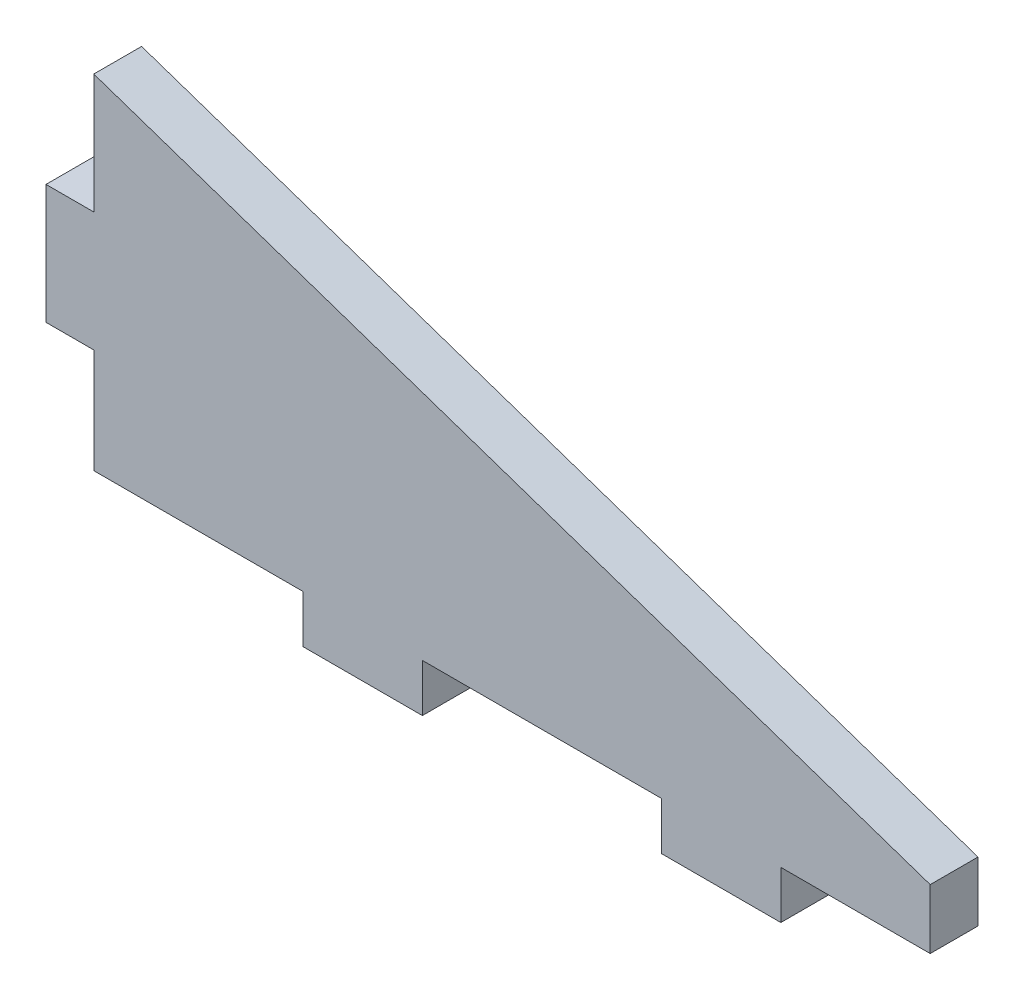
ISO-10303-21;
HEADER;
FILE_DESCRIPTION(('STEP AP214'),'2;1');
FILE_NAME('part.step','',(''),(''),'','','');
FILE_SCHEMA(('AUTOMOTIVE_DESIGN { 1 0 10303 214 1 1 1 1 }'));
ENDSEC;
DATA;
#1=APPLICATION_CONTEXT('core data for automotive mechanical design processes');
#2=APPLICATION_PROTOCOL_DEFINITION('international standard','automotive_design',2000,#1);
#3=PRODUCT_CONTEXT('',#1,'mechanical');
#4=PRODUCT('Part','Part','',(#3));
#5=PRODUCT_RELATED_PRODUCT_CATEGORY('part','',(#4));
#6=PRODUCT_DEFINITION_FORMATION('','',#4);
#7=PRODUCT_DEFINITION_CONTEXT('part definition',#1,'design');
#8=PRODUCT_DEFINITION('design','',#6,#7);
#9=PRODUCT_DEFINITION_SHAPE('','',#8);
#10=(LENGTH_UNIT() NAMED_UNIT(*) SI_UNIT(.MILLI.,.METRE.));
#11=(NAMED_UNIT(*) PLANE_ANGLE_UNIT() SI_UNIT($,.RADIAN.));
#12=(NAMED_UNIT(*) SI_UNIT($,.STERADIAN.) SOLID_ANGLE_UNIT());
#13=UNCERTAINTY_MEASURE_WITH_UNIT(LENGTH_MEASURE(1.E-05),#10,'distance_accuracy_value','');
#14=(GEOMETRIC_REPRESENTATION_CONTEXT(3) GLOBAL_UNCERTAINTY_ASSIGNED_CONTEXT((#13)) GLOBAL_UNIT_ASSIGNED_CONTEXT((#10,
#11,#12)) REPRESENTATION_CONTEXT('',''));
#15=CARTESIAN_POINT('',(0.,0.,0.));
#16=DIRECTION('',(0.,0.,1.));
#17=DIRECTION('',(1.,0.,0.));
#18=AXIS2_PLACEMENT_3D('',#15,#16,#17);
#19=CARTESIAN_POINT('',(-219.5,0.,-4.));
#20=DIRECTION('',(0.,-1.,0.));
#21=DIRECTION('',(-1.,0.,0.));
#22=AXIS2_PLACEMENT_3D('',#19,#20,#21);
#23=PLANE('',#22);
#24=DIRECTION('',(-1.,0.,0.));
#25=VECTOR('',#24,1.);
#26=CARTESIAN_POINT('',(-219.5,0.,4.));
#27=LINE('',#26,#25);
#28=CARTESIAN_POINT('',(-194.5,0.,4.));
#29=VERTEX_POINT('',#28);
#30=CARTESIAN_POINT('',(-219.5,0.,4.));
#31=VERTEX_POINT('',#30);
#32=EDGE_CURVE('E183',#29,#31,#27,.T.);
#33=ORIENTED_EDGE('',*,*,#32,.T.);
#34=DIRECTION('',(0.,0.,1.));
#35=VECTOR('',#34,1.);
#36=CARTESIAN_POINT('',(-219.5,0.,-4.));
#37=LINE('',#36,#35);
#38=CARTESIAN_POINT('',(-219.5,0.,-4.));
#39=VERTEX_POINT('',#38);
#40=EDGE_CURVE('E42',#39,#31,#37,.T.);
#41=ORIENTED_EDGE('',*,*,#40,.F.);
#42=DIRECTION('',(-1.,0.,0.));
#43=VECTOR('',#42,1.);
#44=CARTESIAN_POINT('',(-219.5,0.,-4.));
#45=LINE('',#44,#43);
#46=CARTESIAN_POINT('',(-194.5,0.,-4.));
#47=VERTEX_POINT('',#46);
#48=EDGE_CURVE('E212',#47,#39,#45,.T.);
#49=ORIENTED_EDGE('',*,*,#48,.F.);
#50=DIRECTION('',(0.,0.,1.));
#51=VECTOR('',#50,1.);
#52=CARTESIAN_POINT('',(-194.5,0.,-4.));
#53=LINE('',#52,#51);
#54=EDGE_CURVE('E11',#47,#29,#53,.T.);
#55=ORIENTED_EDGE('',*,*,#54,.T.);
#56=EDGE_LOOP('',(#33,#41,#49,#55));
#57=FACE_BOUND('',#56,.T.);
#58=ADVANCED_FACE('F39',(#57),#23,.T.);
#59=CARTESIAN_POINT('',(-194.5,0.,-4.));
#60=DIRECTION('',(1.,0.,0.));
#61=DIRECTION('',(0.,0.,1.));
#62=AXIS2_PLACEMENT_3D('',#59,#60,#61);
#63=PLANE('',#62);
#64=DIRECTION('',(0.,-1.,0.));
#65=VECTOR('',#64,1.);
#66=CARTESIAN_POINT('',(-194.5,0.,4.));
#67=LINE('',#66,#65);
#68=CARTESIAN_POINT('',(-194.5,9.99999999999999,4.));
#69=VERTEX_POINT('',#68);
#70=EDGE_CURVE('E116',#69,#29,#67,.T.);
#71=ORIENTED_EDGE('',*,*,#70,.T.);
#72=ORIENTED_EDGE('',*,*,#54,.F.);
#73=DIRECTION('',(0.,-1.,0.));
#74=VECTOR('',#73,1.);
#75=CARTESIAN_POINT('',(-194.5,0.,-4.));
#76=LINE('',#75,#74);
#77=CARTESIAN_POINT('',(-194.5,9.99999999999999,-4.));
#78=VERTEX_POINT('',#77);
#79=EDGE_CURVE('E57',#78,#47,#76,.T.);
#80=ORIENTED_EDGE('',*,*,#79,.F.);
#81=DIRECTION('',(0.,0.,1.));
#82=VECTOR('',#81,1.);
#83=CARTESIAN_POINT('',(-194.5,9.99999999999999,-4.));
#84=LINE('',#83,#82);
#85=EDGE_CURVE('E48',#78,#69,#84,.T.);
#86=ORIENTED_EDGE('',*,*,#85,.T.);
#87=EDGE_LOOP('',(#71,#72,#80,#86));
#88=FACE_BOUND('',#87,.T.);
#89=ADVANCED_FACE('F337',(#88),#63,.T.);
#90=CARTESIAN_POINT('',(-194.5,9.99999999999999,-4.));
#91=DIRECTION('',(0.32129634474976,0.946978700315083,0.));
#92=DIRECTION('',(0.946978700315083,-0.32129634474976,0.));
#93=AXIS2_PLACEMENT_3D('',#90,#91,#92);
#94=PLANE('',#93);
#95=DIRECTION('',(0.946978700315083,-0.32129634474976,0.));
#96=VECTOR('',#95,1.);
#97=CARTESIAN_POINT('',(-194.5,9.99999999999999,4.));
#98=LINE('',#97,#96);
#99=CARTESIAN_POINT('',(-334.5,57.5,4.));
#100=VERTEX_POINT('',#99);
#101=EDGE_CURVE('E110',#100,#69,#98,.T.);
#102=ORIENTED_EDGE('',*,*,#101,.T.);
#103=ORIENTED_EDGE('',*,*,#85,.F.);
#104=DIRECTION('',(0.946978700315083,-0.32129634474976,0.));
#105=VECTOR('',#104,1.);
#106=CARTESIAN_POINT('',(-194.5,9.99999999999999,-4.));
#107=LINE('',#106,#105);
#108=CARTESIAN_POINT('',(-334.5,57.5,-4.));
#109=VERTEX_POINT('',#108);
#110=EDGE_CURVE('E165',#109,#78,#107,.T.);
#111=ORIENTED_EDGE('',*,*,#110,.F.);
#112=DIRECTION('',(0.,0.,1.));
#113=VECTOR('',#112,1.);
#114=CARTESIAN_POINT('',(-334.5,57.5,-4.));
#115=LINE('',#114,#113);
#116=EDGE_CURVE('E172',#109,#100,#115,.T.);
#117=ORIENTED_EDGE('',*,*,#116,.T.);
#118=EDGE_LOOP('',(#102,#103,#111,#117));
#119=FACE_BOUND('',#118,.T.);
#120=ADVANCED_FACE('F178',(#119),#94,.T.);
#121=CARTESIAN_POINT('',(-334.5,57.5,-4.));
#122=DIRECTION('',(-1.,0.,0.));
#123=DIRECTION('',(0.,0.,-1.));
#124=AXIS2_PLACEMENT_3D('',#121,#122,#123);
#125=PLANE('',#124);
#126=DIRECTION('',(0.,1.,0.));
#127=VECTOR('',#126,1.);
#128=CARTESIAN_POINT('',(-334.5,57.5,4.));
#129=LINE('',#128,#127);
#130=CARTESIAN_POINT('',(-334.5,37.5,4.));
#131=VERTEX_POINT('',#130);
#132=EDGE_CURVE('E175',#131,#100,#129,.T.);
#133=ORIENTED_EDGE('',*,*,#132,.T.);
#134=ORIENTED_EDGE('',*,*,#116,.F.);
#135=DIRECTION('',(0.,1.,0.));
#136=VECTOR('',#135,1.);
#137=CARTESIAN_POINT('',(-334.5,57.5,-4.));
#138=LINE('',#137,#136);
#139=CARTESIAN_POINT('',(-334.5,37.5,-4.));
#140=VERTEX_POINT('',#139);
#141=EDGE_CURVE('E161',#140,#109,#138,.T.);
#142=ORIENTED_EDGE('',*,*,#141,.F.);
#143=DIRECTION('',(0.,0.,1.));
#144=VECTOR('',#143,1.);
#145=CARTESIAN_POINT('',(-334.5,37.5,-4.));
#146=LINE('',#145,#144);
#147=EDGE_CURVE('E176',#140,#131,#146,.T.);
#148=ORIENTED_EDGE('',*,*,#147,.T.);
#149=EDGE_LOOP('',(#133,#134,#142,#148));
#150=FACE_BOUND('',#149,.T.);
#151=ADVANCED_FACE('F173',(#150),#125,.T.);
#152=CARTESIAN_POINT('',(-334.5,37.5,-4.));
#153=DIRECTION('',(0.,1.,0.));
#154=DIRECTION('',(0.,0.,1.));
#155=AXIS2_PLACEMENT_3D('',#152,#153,#154);
#156=PLANE('',#155);
#157=DIRECTION('',(1.,0.,0.));
#158=VECTOR('',#157,1.);
#159=CARTESIAN_POINT('',(-334.5,37.5,4.));
#160=LINE('',#159,#158);
#161=CARTESIAN_POINT('',(-342.5,37.5,4.));
#162=VERTEX_POINT('',#161);
#163=EDGE_CURVE('E208',#162,#131,#160,.T.);
#164=ORIENTED_EDGE('',*,*,#163,.T.);
#165=ORIENTED_EDGE('',*,*,#147,.F.);
#166=DIRECTION('',(1.,0.,0.));
#167=VECTOR('',#166,1.);
#168=CARTESIAN_POINT('',(-334.5,37.5,-4.));
#169=LINE('',#168,#167);
#170=CARTESIAN_POINT('',(-342.5,37.5,-4.));
#171=VERTEX_POINT('',#170);
#172=EDGE_CURVE('E167',#171,#140,#169,.T.);
#173=ORIENTED_EDGE('',*,*,#172,.F.);
#174=DIRECTION('',(0.,0.,1.));
#175=VECTOR('',#174,1.);
#176=CARTESIAN_POINT('',(-342.5,37.5,-4.));
#177=LINE('',#176,#175);
#178=EDGE_CURVE('E216',#171,#162,#177,.T.);
#179=ORIENTED_EDGE('',*,*,#178,.T.);
#180=EDGE_LOOP('',(#164,#165,#173,#179));
#181=FACE_BOUND('',#180,.T.);
#182=ADVANCED_FACE('F296',(#181),#156,.T.);
#183=CARTESIAN_POINT('',(-342.5,37.5,-4.));
#184=DIRECTION('',(-1.,0.,0.));
#185=DIRECTION('',(0.,0.,-1.));
#186=AXIS2_PLACEMENT_3D('',#183,#184,#185);
#187=PLANE('',#186);
#188=DIRECTION('',(0.,1.,0.));
#189=VECTOR('',#188,1.);
#190=CARTESIAN_POINT('',(-342.5,37.5,4.));
#191=LINE('',#190,#189);
#192=CARTESIAN_POINT('',(-342.5,17.5,4.));
#193=VERTEX_POINT('',#192);
#194=EDGE_CURVE('E206',#193,#162,#191,.T.);
#195=ORIENTED_EDGE('',*,*,#194,.T.);
#196=ORIENTED_EDGE('',*,*,#178,.F.);
#197=DIRECTION('',(0.,1.,0.));
#198=VECTOR('',#197,1.);
#199=CARTESIAN_POINT('',(-342.5,37.5,-4.));
#200=LINE('',#199,#198);
#201=CARTESIAN_POINT('',(-342.5,17.5,-4.));
#202=VERTEX_POINT('',#201);
#203=EDGE_CURVE('E286',#202,#171,#200,.T.);
#204=ORIENTED_EDGE('',*,*,#203,.F.);
#205=DIRECTION('',(0.,0.,1.));
#206=VECTOR('',#205,1.);
#207=CARTESIAN_POINT('',(-342.5,17.5,-4.));
#208=LINE('',#207,#206);
#209=EDGE_CURVE('E219',#202,#193,#208,.T.);
#210=ORIENTED_EDGE('',*,*,#209,.T.);
#211=EDGE_LOOP('',(#195,#196,#204,#210));
#212=FACE_BOUND('',#211,.T.);
#213=ADVANCED_FACE('F292',(#212),#187,.T.);
#214=CARTESIAN_POINT('',(-342.5,17.5,-4.));
#215=DIRECTION('',(0.,-1.,0.));
#216=DIRECTION('',(0.,0.,-1.));
#217=AXIS2_PLACEMENT_3D('',#214,#215,#216);
#218=PLANE('',#217);
#219=DIRECTION('',(-1.,0.,0.));
#220=VECTOR('',#219,1.);
#221=CARTESIAN_POINT('',(-342.5,17.5,4.));
#222=LINE('',#221,#220);
#223=CARTESIAN_POINT('',(-334.5,17.5,4.));
#224=VERTEX_POINT('',#223);
#225=EDGE_CURVE('E204',#224,#193,#222,.T.);
#226=ORIENTED_EDGE('',*,*,#225,.T.);
#227=ORIENTED_EDGE('',*,*,#209,.F.);
#228=DIRECTION('',(-1.,0.,0.));
#229=VECTOR('',#228,1.);
#230=CARTESIAN_POINT('',(-342.5,17.5,-4.));
#231=LINE('',#230,#229);
#232=CARTESIAN_POINT('',(-334.5,17.5,-4.));
#233=VERTEX_POINT('',#232);
#234=EDGE_CURVE('E284',#233,#202,#231,.T.);
#235=ORIENTED_EDGE('',*,*,#234,.F.);
#236=DIRECTION('',(0.,0.,1.));
#237=VECTOR('',#236,1.);
#238=CARTESIAN_POINT('',(-334.5,17.5,-4.));
#239=LINE('',#238,#237);
#240=EDGE_CURVE('E222',#233,#224,#239,.T.);
#241=ORIENTED_EDGE('',*,*,#240,.T.);
#242=EDGE_LOOP('',(#226,#227,#235,#241));
#243=FACE_BOUND('',#242,.T.);
#244=ADVANCED_FACE('F301',(#243),#218,.T.);
#245=CARTESIAN_POINT('',(-334.5,17.5,-4.));
#246=DIRECTION('',(-1.,0.,0.));
#247=DIRECTION('',(0.,0.,-1.));
#248=AXIS2_PLACEMENT_3D('',#245,#246,#247);
#249=PLANE('',#248);
#250=DIRECTION('',(0.,1.,0.));
#251=VECTOR('',#250,1.);
#252=CARTESIAN_POINT('',(-334.5,17.5,4.));
#253=LINE('',#252,#251);
#254=CARTESIAN_POINT('',(-334.5,0.,4.));
#255=VERTEX_POINT('',#254);
#256=EDGE_CURVE('E202',#255,#224,#253,.T.);
#257=ORIENTED_EDGE('',*,*,#256,.T.);
#258=ORIENTED_EDGE('',*,*,#240,.F.);
#259=DIRECTION('',(0.,1.,0.));
#260=VECTOR('',#259,1.);
#261=CARTESIAN_POINT('',(-334.5,17.5,-4.));
#262=LINE('',#261,#260);
#263=CARTESIAN_POINT('',(-334.5,0.,-4.));
#264=VERTEX_POINT('',#263);
#265=EDGE_CURVE('E282',#264,#233,#262,.T.);
#266=ORIENTED_EDGE('',*,*,#265,.F.);
#267=DIRECTION('',(0.,0.,1.));
#268=VECTOR('',#267,1.);
#269=CARTESIAN_POINT('',(-334.5,0.,-4.));
#270=LINE('',#269,#268);
#271=EDGE_CURVE('E225',#264,#255,#270,.T.);
#272=ORIENTED_EDGE('',*,*,#271,.T.);
#273=EDGE_LOOP('',(#257,#258,#266,#272));
#274=FACE_BOUND('',#273,.T.);
#275=ADVANCED_FACE('F305',(#274),#249,.T.);
#276=CARTESIAN_POINT('',(-334.5,0.,-4.));
#277=DIRECTION('',(0.,-1.,0.));
#278=DIRECTION('',(0.,0.,-1.));
#279=AXIS2_PLACEMENT_3D('',#276,#277,#278);
#280=PLANE('',#279);
#281=DIRECTION('',(-1.,0.,0.));
#282=VECTOR('',#281,1.);
#283=CARTESIAN_POINT('',(-334.5,0.,4.));
#284=LINE('',#283,#282);
#285=CARTESIAN_POINT('',(-299.5,0.,4.));
#286=VERTEX_POINT('',#285);
#287=EDGE_CURVE('E200',#286,#255,#284,.T.);
#288=ORIENTED_EDGE('',*,*,#287,.T.);
#289=ORIENTED_EDGE('',*,*,#271,.F.);
#290=DIRECTION('',(-1.,0.,0.));
#291=VECTOR('',#290,1.);
#292=CARTESIAN_POINT('',(-334.5,0.,-4.));
#293=LINE('',#292,#291);
#294=CARTESIAN_POINT('',(-299.5,0.,-4.));
#295=VERTEX_POINT('',#294);
#296=EDGE_CURVE('E280',#295,#264,#293,.T.);
#297=ORIENTED_EDGE('',*,*,#296,.F.);
#298=DIRECTION('',(0.,0.,1.));
#299=VECTOR('',#298,1.);
#300=CARTESIAN_POINT('',(-299.5,0.,-4.));
#301=LINE('',#300,#299);
#302=EDGE_CURVE('E228',#295,#286,#301,.T.);
#303=ORIENTED_EDGE('',*,*,#302,.T.);
#304=EDGE_LOOP('',(#288,#289,#297,#303));
#305=FACE_BOUND('',#304,.T.);
#306=ADVANCED_FACE('F309',(#305),#280,.T.);
#307=CARTESIAN_POINT('',(-299.5,0.,-4.));
#308=DIRECTION('',(-1.,0.,0.));
#309=DIRECTION('',(0.,0.,-1.));
#310=AXIS2_PLACEMENT_3D('',#307,#308,#309);
#311=PLANE('',#310);
#312=DIRECTION('',(0.,1.,0.));
#313=VECTOR('',#312,1.);
#314=CARTESIAN_POINT('',(-299.5,0.,4.));
#315=LINE('',#314,#313);
#316=CARTESIAN_POINT('',(-299.5,-8.,4.));
#317=VERTEX_POINT('',#316);
#318=EDGE_CURVE('E198',#317,#286,#315,.T.);
#319=ORIENTED_EDGE('',*,*,#318,.T.);
#320=ORIENTED_EDGE('',*,*,#302,.F.);
#321=DIRECTION('',(0.,1.,0.));
#322=VECTOR('',#321,1.);
#323=CARTESIAN_POINT('',(-299.5,0.,-4.));
#324=LINE('',#323,#322);
#325=CARTESIAN_POINT('',(-299.5,-8.,-4.));
#326=VERTEX_POINT('',#325);
#327=EDGE_CURVE('E278',#326,#295,#324,.T.);
#328=ORIENTED_EDGE('',*,*,#327,.F.);
#329=DIRECTION('',(0.,0.,1.));
#330=VECTOR('',#329,1.);
#331=CARTESIAN_POINT('',(-299.5,-8.,-4.));
#332=LINE('',#331,#330);
#333=EDGE_CURVE('E231',#326,#317,#332,.T.);
#334=ORIENTED_EDGE('',*,*,#333,.T.);
#335=EDGE_LOOP('',(#319,#320,#328,#334));
#336=FACE_BOUND('',#335,.T.);
#337=ADVANCED_FACE('F315',(#336),#311,.T.);
#338=CARTESIAN_POINT('',(-299.5,-8.,-4.));
#339=DIRECTION('',(0.,-1.,0.));
#340=DIRECTION('',(-1.,0.,0.));
#341=AXIS2_PLACEMENT_3D('',#338,#339,#340);
#342=PLANE('',#341);
#343=DIRECTION('',(-1.,0.,0.));
#344=VECTOR('',#343,1.);
#345=CARTESIAN_POINT('',(-299.5,-8.,4.));
#346=LINE('',#345,#344);
#347=CARTESIAN_POINT('',(-279.5,-8.,4.));
#348=VERTEX_POINT('',#347);
#349=EDGE_CURVE('E196',#348,#317,#346,.T.);
#350=ORIENTED_EDGE('',*,*,#349,.T.);
#351=ORIENTED_EDGE('',*,*,#333,.F.);
#352=DIRECTION('',(-1.,0.,0.));
#353=VECTOR('',#352,1.);
#354=CARTESIAN_POINT('',(-299.5,-8.,-4.));
#355=LINE('',#354,#353);
#356=CARTESIAN_POINT('',(-279.5,-8.,-4.));
#357=VERTEX_POINT('',#356);
#358=EDGE_CURVE('E276',#357,#326,#355,.T.);
#359=ORIENTED_EDGE('',*,*,#358,.F.);
#360=DIRECTION('',(0.,0.,1.));
#361=VECTOR('',#360,1.);
#362=CARTESIAN_POINT('',(-279.5,-8.,-4.));
#363=LINE('',#362,#361);
#364=EDGE_CURVE('E234',#357,#348,#363,.T.);
#365=ORIENTED_EDGE('',*,*,#364,.T.);
#366=EDGE_LOOP('',(#350,#351,#359,#365));
#367=FACE_BOUND('',#366,.T.);
#368=ADVANCED_FACE('F320',(#367),#342,.T.);
#369=CARTESIAN_POINT('',(-279.5,-8.,-4.));
#370=DIRECTION('',(1.,0.,0.));
#371=DIRECTION('',(0.,0.,1.));
#372=AXIS2_PLACEMENT_3D('',#369,#370,#371);
#373=PLANE('',#372);
#374=DIRECTION('',(0.,-1.,0.));
#375=VECTOR('',#374,1.);
#376=CARTESIAN_POINT('',(-279.5,-8.,4.));
#377=LINE('',#376,#375);
#378=CARTESIAN_POINT('',(-279.5,0.,4.));
#379=VERTEX_POINT('',#378);
#380=EDGE_CURVE('E194',#379,#348,#377,.T.);
#381=ORIENTED_EDGE('',*,*,#380,.T.);
#382=ORIENTED_EDGE('',*,*,#364,.F.);
#383=DIRECTION('',(0.,-1.,0.));
#384=VECTOR('',#383,1.);
#385=CARTESIAN_POINT('',(-279.5,-8.,-4.));
#386=LINE('',#385,#384);
#387=CARTESIAN_POINT('',(-279.5,0.,-4.));
#388=VERTEX_POINT('',#387);
#389=EDGE_CURVE('E270',#388,#357,#386,.T.);
#390=ORIENTED_EDGE('',*,*,#389,.F.);
#391=DIRECTION('',(0.,0.,1.));
#392=VECTOR('',#391,1.);
#393=CARTESIAN_POINT('',(-279.5,0.,-4.));
#394=LINE('',#393,#392);
#395=EDGE_CURVE('E237',#388,#379,#394,.T.);
#396=ORIENTED_EDGE('',*,*,#395,.T.);
#397=EDGE_LOOP('',(#381,#382,#390,#396));
#398=FACE_BOUND('',#397,.T.);
#399=ADVANCED_FACE('F324',(#398),#373,.T.);
#400=CARTESIAN_POINT('',(-279.5,0.,-4.));
#401=DIRECTION('',(0.,-1.,0.));
#402=DIRECTION('',(-1.,0.,0.));
#403=AXIS2_PLACEMENT_3D('',#400,#401,#402);
#404=PLANE('',#403);
#405=DIRECTION('',(-1.,0.,0.));
#406=VECTOR('',#405,1.);
#407=CARTESIAN_POINT('',(-279.5,0.,4.));
#408=LINE('',#407,#406);
#409=CARTESIAN_POINT('',(-239.5,0.,4.));
#410=VERTEX_POINT('',#409);
#411=EDGE_CURVE('E192',#410,#379,#408,.T.);
#412=ORIENTED_EDGE('',*,*,#411,.T.);
#413=ORIENTED_EDGE('',*,*,#395,.F.);
#414=DIRECTION('',(-1.,0.,0.));
#415=VECTOR('',#414,1.);
#416=CARTESIAN_POINT('',(-279.5,0.,-4.));
#417=LINE('',#416,#415);
#418=CARTESIAN_POINT('',(-239.5,0.,-4.));
#419=VERTEX_POINT('',#418);
#420=EDGE_CURVE('E267',#419,#388,#417,.T.);
#421=ORIENTED_EDGE('',*,*,#420,.F.);
#422=DIRECTION('',(0.,0.,1.));
#423=VECTOR('',#422,1.);
#424=CARTESIAN_POINT('',(-239.5,0.,-4.));
#425=LINE('',#424,#423);
#426=EDGE_CURVE('E240',#419,#410,#425,.T.);
#427=ORIENTED_EDGE('',*,*,#426,.T.);
#428=EDGE_LOOP('',(#412,#413,#421,#427));
#429=FACE_BOUND('',#428,.T.);
#430=ADVANCED_FACE('F327',(#429),#404,.T.);
#431=CARTESIAN_POINT('',(-239.5,-8.,-4.));
#432=DIRECTION('',(-1.,0.,0.));
#433=DIRECTION('',(0.,0.,-1.));
#434=AXIS2_PLACEMENT_3D('',#431,#432,#433);
#435=PLANE('',#434);
#436=DIRECTION('',(0.,1.,0.));
#437=VECTOR('',#436,1.);
#438=CARTESIAN_POINT('',(-239.5,-8.,4.));
#439=LINE('',#438,#437);
#440=CARTESIAN_POINT('',(-239.5,-8.,4.));
#441=VERTEX_POINT('',#440);
#442=EDGE_CURVE('E190',#441,#410,#439,.T.);
#443=ORIENTED_EDGE('',*,*,#442,.T.);
#444=ORIENTED_EDGE('',*,*,#426,.F.);
#445=DIRECTION('',(0.,1.,0.));
#446=VECTOR('',#445,1.);
#447=CARTESIAN_POINT('',(-239.5,-8.,-4.));
#448=LINE('',#447,#446);
#449=CARTESIAN_POINT('',(-239.5,-8.,-4.));
#450=VERTEX_POINT('',#449);
#451=EDGE_CURVE('E265',#450,#419,#448,.T.);
#452=ORIENTED_EDGE('',*,*,#451,.F.);
#453=DIRECTION('',(0.,0.,1.));
#454=VECTOR('',#453,1.);
#455=CARTESIAN_POINT('',(-239.5,-8.,-4.));
#456=LINE('',#455,#454);
#457=EDGE_CURVE('E243',#450,#441,#456,.T.);
#458=ORIENTED_EDGE('',*,*,#457,.T.);
#459=EDGE_LOOP('',(#443,#444,#452,#458));
#460=FACE_BOUND('',#459,.T.);
#461=ADVANCED_FACE('F263',(#460),#435,.T.);
#462=CARTESIAN_POINT('',(-219.5,-8.,-4.));
#463=DIRECTION('',(0.,-1.,0.));
#464=DIRECTION('',(0.,0.,-1.));
#465=AXIS2_PLACEMENT_3D('',#462,#463,#464);
#466=PLANE('',#465);
#467=DIRECTION('',(-1.,0.,0.));
#468=VECTOR('',#467,1.);
#469=CARTESIAN_POINT('',(-219.5,-8.,4.));
#470=LINE('',#469,#468);
#471=CARTESIAN_POINT('',(-219.5,-8.,4.));
#472=VERTEX_POINT('',#471);
#473=EDGE_CURVE('E188',#472,#441,#470,.T.);
#474=ORIENTED_EDGE('',*,*,#473,.T.);
#475=ORIENTED_EDGE('',*,*,#457,.F.);
#476=DIRECTION('',(-1.,0.,0.));
#477=VECTOR('',#476,1.);
#478=CARTESIAN_POINT('',(-219.5,-8.,-4.));
#479=LINE('',#478,#477);
#480=CARTESIAN_POINT('',(-219.5,-8.,-4.));
#481=VERTEX_POINT('',#480);
#482=EDGE_CURVE('E268',#481,#450,#479,.T.);
#483=ORIENTED_EDGE('',*,*,#482,.F.);
#484=DIRECTION('',(0.,0.,1.));
#485=VECTOR('',#484,1.);
#486=CARTESIAN_POINT('',(-219.5,-8.,-4.));
#487=LINE('',#486,#485);
#488=EDGE_CURVE('E245',#481,#472,#487,.T.);
#489=ORIENTED_EDGE('',*,*,#488,.T.);
#490=EDGE_LOOP('',(#474,#475,#483,#489));
#491=FACE_BOUND('',#490,.T.);
#492=ADVANCED_FACE('F260',(#491),#466,.T.);
#493=CARTESIAN_POINT('',(-219.5,0.,-4.));
#494=DIRECTION('',(1.,0.,0.));
#495=DIRECTION('',(0.,0.,1.));
#496=AXIS2_PLACEMENT_3D('',#493,#494,#495);
#497=PLANE('',#496);
#498=DIRECTION('',(0.,-1.,0.));
#499=VECTOR('',#498,1.);
#500=CARTESIAN_POINT('',(-219.5,0.,4.));
#501=LINE('',#500,#499);
#502=EDGE_CURVE('E186',#31,#472,#501,.T.);
#503=ORIENTED_EDGE('',*,*,#502,.T.);
#504=ORIENTED_EDGE('',*,*,#488,.F.);
#505=DIRECTION('',(0.,-1.,0.));
#506=VECTOR('',#505,1.);
#507=CARTESIAN_POINT('',(-219.5,0.,-4.));
#508=LINE('',#507,#506);
#509=EDGE_CURVE('E124',#39,#481,#508,.T.);
#510=ORIENTED_EDGE('',*,*,#509,.F.);
#511=ORIENTED_EDGE('',*,*,#40,.T.);
#512=EDGE_LOOP('',(#503,#504,#510,#511));
#513=FACE_BOUND('',#512,.T.);
#514=ADVANCED_FACE('F251',(#513),#497,.T.);
#515=CARTESIAN_POINT('',(0.,0.,-4.));
#516=DIRECTION('',(0.,0.,-1.));
#517=DIRECTION('',(1.,0.,0.));
#518=AXIS2_PLACEMENT_3D('',#515,#516,#517);
#519=PLANE('',#518);
#520=ORIENTED_EDGE('',*,*,#48,.T.);
#521=ORIENTED_EDGE('',*,*,#509,.T.);
#522=ORIENTED_EDGE('',*,*,#482,.T.);
#523=ORIENTED_EDGE('',*,*,#451,.T.);
#524=ORIENTED_EDGE('',*,*,#420,.T.);
#525=ORIENTED_EDGE('',*,*,#389,.T.);
#526=ORIENTED_EDGE('',*,*,#358,.T.);
#527=ORIENTED_EDGE('',*,*,#327,.T.);
#528=ORIENTED_EDGE('',*,*,#296,.T.);
#529=ORIENTED_EDGE('',*,*,#265,.T.);
#530=ORIENTED_EDGE('',*,*,#234,.T.);
#531=ORIENTED_EDGE('',*,*,#203,.T.);
#532=ORIENTED_EDGE('',*,*,#172,.T.);
#533=ORIENTED_EDGE('',*,*,#141,.T.);
#534=ORIENTED_EDGE('',*,*,#110,.T.);
#535=ORIENTED_EDGE('',*,*,#79,.T.);
#536=EDGE_LOOP('',(#520,#521,#522,#523,#524,#525,#526,#527,#528,#529,#530,#531,#532,#533,#534,#535));
#537=FACE_BOUND('',#536,.T.);
#538=ADVANCED_FACE('F163',(#537),#519,.T.);
#539=CARTESIAN_POINT('',(0.,0.,4.));
#540=DIRECTION('',(0.,0.,-1.));
#541=DIRECTION('',(1.,0.,0.));
#542=AXIS2_PLACEMENT_3D('',#539,#540,#541);
#543=PLANE('',#542);
#544=ORIENTED_EDGE('',*,*,#32,.F.);
#545=ORIENTED_EDGE('',*,*,#70,.F.);
#546=ORIENTED_EDGE('',*,*,#101,.F.);
#547=ORIENTED_EDGE('',*,*,#132,.F.);
#548=ORIENTED_EDGE('',*,*,#163,.F.);
#549=ORIENTED_EDGE('',*,*,#194,.F.);
#550=ORIENTED_EDGE('',*,*,#225,.F.);
#551=ORIENTED_EDGE('',*,*,#256,.F.);
#552=ORIENTED_EDGE('',*,*,#287,.F.);
#553=ORIENTED_EDGE('',*,*,#318,.F.);
#554=ORIENTED_EDGE('',*,*,#349,.F.);
#555=ORIENTED_EDGE('',*,*,#380,.F.);
#556=ORIENTED_EDGE('',*,*,#411,.F.);
#557=ORIENTED_EDGE('',*,*,#442,.F.);
#558=ORIENTED_EDGE('',*,*,#473,.F.);
#559=ORIENTED_EDGE('',*,*,#502,.F.);
#560=EDGE_LOOP('',(#544,#545,#546,#547,#548,#549,#550,#551,#552,#553,#554,#555,#556,#557,#558,#559));
#561=FACE_BOUND('',#560,.T.);
#562=ADVANCED_FACE('F256',(#561),#543,.F.);
#563=CLOSED_SHELL('',(#58,#89,#120,#151,#182,#213,#244,#275,#306,#337,#368,#399,#430,#461,#492,
#514,#538,#562));
#564=MANIFOLD_SOLID_BREP('B2',#563);
#565=ADVANCED_BREP_SHAPE_REPRESENTATION('',(#18,#564),#14);
#566=SHAPE_DEFINITION_REPRESENTATION(#9,#565);
ENDSEC;
END-ISO-10303-21;
